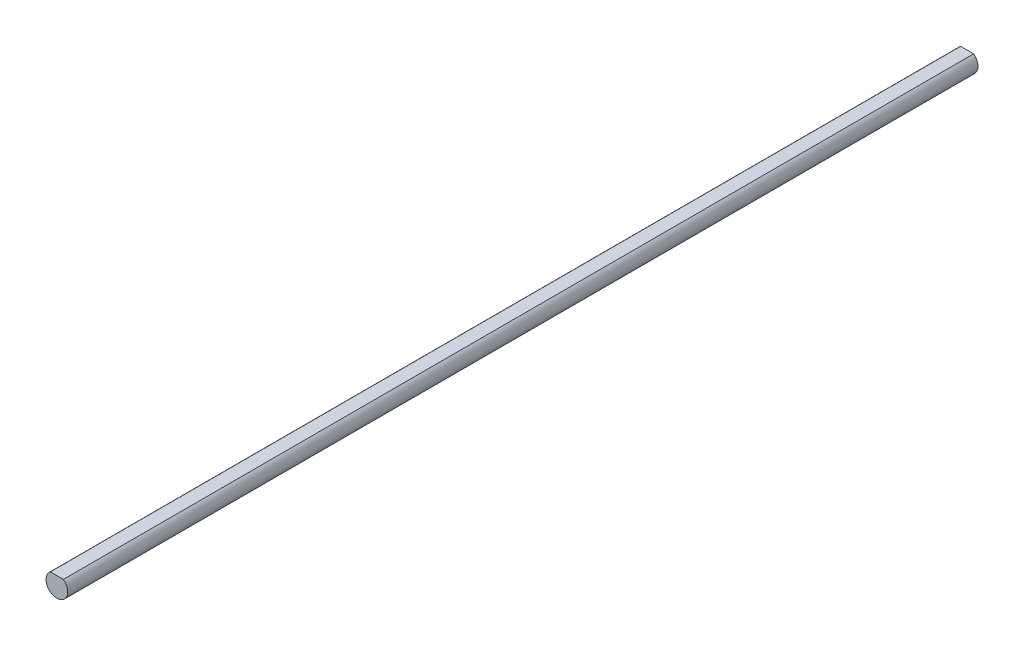
ISO-10303-21;
HEADER;
FILE_DESCRIPTION(('STEP AP214'),'2;1');
FILE_NAME('part.step','',(''),(''),'','','');
FILE_SCHEMA(('AUTOMOTIVE_DESIGN { 1 0 10303 214 1 1 1 1 }'));
ENDSEC;
DATA;
#1=APPLICATION_CONTEXT('core data for automotive mechanical design processes');
#2=APPLICATION_PROTOCOL_DEFINITION('international standard','automotive_design',2000,#1);
#3=PRODUCT_CONTEXT('',#1,'mechanical');
#4=PRODUCT('Part','Part','',(#3));
#5=PRODUCT_RELATED_PRODUCT_CATEGORY('part','',(#4));
#6=PRODUCT_DEFINITION_FORMATION('','',#4);
#7=PRODUCT_DEFINITION_CONTEXT('part definition',#1,'design');
#8=PRODUCT_DEFINITION('design','',#6,#7);
#9=PRODUCT_DEFINITION_SHAPE('','',#8);
#10=(LENGTH_UNIT() NAMED_UNIT(*) SI_UNIT(.MILLI.,.METRE.));
#11=(NAMED_UNIT(*) PLANE_ANGLE_UNIT() SI_UNIT($,.RADIAN.));
#12=(NAMED_UNIT(*) SI_UNIT($,.STERADIAN.) SOLID_ANGLE_UNIT());
#13=UNCERTAINTY_MEASURE_WITH_UNIT(LENGTH_MEASURE(1.E-05),#10,'distance_accuracy_value','');
#14=(GEOMETRIC_REPRESENTATION_CONTEXT(3) GLOBAL_UNCERTAINTY_ASSIGNED_CONTEXT((#13)) GLOBAL_UNIT_ASSIGNED_CONTEXT((#10,
#11,#12)) REPRESENTATION_CONTEXT('',''));
#15=CARTESIAN_POINT('',(0.,0.,0.));
#16=DIRECTION('',(0.,0.,1.));
#17=DIRECTION('',(1.,0.,0.));
#18=AXIS2_PLACEMENT_3D('',#15,#16,#17);
#19=CARTESIAN_POINT('',(0.,0.,265.8872));
#20=DIRECTION('',(0.,0.,-1.));
#21=DIRECTION('',(-1.,0.,0.));
#22=AXIS2_PLACEMENT_3D('',#19,#20,#21);
#23=CYLINDRICAL_SURFACE('',#22,3.175);
#24=CARTESIAN_POINT('',(0.,0.,265.8872));
#25=DIRECTION('',(0.,0.,1.));
#26=DIRECTION('',(1.,0.,0.));
#27=AXIS2_PLACEMENT_3D('',#24,#25,#26);
#28=CIRCLE('',#27,3.175);
#29=CARTESIAN_POINT('',(-1.905,2.54,265.8872));
#30=VERTEX_POINT('',#29);
#31=CARTESIAN_POINT('',(1.905,2.54,265.8872));
#32=VERTEX_POINT('',#31);
#33=EDGE_CURVE('E43',#30,#32,#28,.T.);
#34=ORIENTED_EDGE('',*,*,#33,.F.);
#35=DIRECTION('',(0.,0.,-1.));
#36=VECTOR('',#35,1.);
#37=CARTESIAN_POINT('',(-1.905,2.54,265.8872));
#38=LINE('',#37,#36);
#39=CARTESIAN_POINT('',(-1.905,2.54,0.));
#40=VERTEX_POINT('',#39);
#41=EDGE_CURVE('E60',#30,#40,#38,.T.);
#42=ORIENTED_EDGE('',*,*,#41,.T.);
#43=CARTESIAN_POINT('',(0.,0.,0.));
#44=DIRECTION('',(0.,0.,1.));
#45=DIRECTION('',(1.,0.,0.));
#46=AXIS2_PLACEMENT_3D('',#43,#44,#45);
#47=CIRCLE('',#46,3.175);
#48=CARTESIAN_POINT('',(1.905,2.54,0.));
#49=VERTEX_POINT('',#48);
#50=EDGE_CURVE('E66',#40,#49,#47,.T.);
#51=ORIENTED_EDGE('',*,*,#50,.T.);
#52=DIRECTION('',(0.,0.,-1.));
#53=VECTOR('',#52,1.);
#54=CARTESIAN_POINT('',(1.905,2.54,265.8872));
#55=LINE('',#54,#53);
#56=EDGE_CURVE('E50',#49,#32,#55,.F.);
#57=ORIENTED_EDGE('',*,*,#56,.T.);
#58=EDGE_LOOP('',(#34,#42,#51,#57));
#59=FACE_BOUND('',#58,.T.);
#60=ADVANCED_FACE('F36',(#59),#23,.T.);
#61=CARTESIAN_POINT('',(0.,0.,265.8872));
#62=DIRECTION('',(0.,0.,1.));
#63=DIRECTION('',(1.,0.,0.));
#64=AXIS2_PLACEMENT_3D('',#61,#62,#63);
#65=PLANE('',#64);
#66=DIRECTION('',(1.,0.,0.));
#67=VECTOR('',#66,1.);
#68=CARTESIAN_POINT('',(-3.40213758035115,2.54,265.8872));
#69=LINE('',#68,#67);
#70=EDGE_CURVE('E54',#30,#32,#69,.T.);
#71=ORIENTED_EDGE('',*,*,#70,.F.);
#72=ORIENTED_EDGE('',*,*,#33,.T.);
#73=EDGE_LOOP('',(#71,#72));
#74=FACE_BOUND('',#73,.T.);
#75=ADVANCED_FACE('F74',(#74),#65,.T.);
#76=CARTESIAN_POINT('',(0.,0.,0.));
#77=DIRECTION('',(0.,0.,1.));
#78=DIRECTION('',(1.,0.,0.));
#79=AXIS2_PLACEMENT_3D('',#76,#77,#78);
#80=PLANE('',#79);
#81=ORIENTED_EDGE('',*,*,#50,.F.);
#82=DIRECTION('',(1.,0.,0.));
#83=VECTOR('',#82,1.);
#84=CARTESIAN_POINT('',(0.,2.54,0.));
#85=LINE('',#84,#83);
#86=EDGE_CURVE('E11',#40,#49,#85,.T.);
#87=ORIENTED_EDGE('',*,*,#86,.T.);
#88=EDGE_LOOP('',(#81,#87));
#89=FACE_BOUND('',#88,.T.);
#90=ADVANCED_FACE('F69',(#89),#80,.F.);
#91=CARTESIAN_POINT('',(-3.40213758035115,2.54,-6.89520984968928));
#92=DIRECTION('',(0.,-1.,0.));
#93=DIRECTION('',(0.,0.,-1.));
#94=AXIS2_PLACEMENT_3D('',#91,#92,#93);
#95=PLANE('',#94);
#96=ORIENTED_EDGE('',*,*,#70,.T.);
#97=ORIENTED_EDGE('',*,*,#56,.F.);
#98=ORIENTED_EDGE('',*,*,#86,.F.);
#99=ORIENTED_EDGE('',*,*,#41,.F.);
#100=EDGE_LOOP('',(#96,#97,#98,#99));
#101=FACE_BOUND('',#100,.T.);
#102=ADVANCED_FACE('F59',(#101),#95,.F.);
#103=CLOSED_SHELL('',(#60,#75,#90,#102));
#104=MANIFOLD_SOLID_BREP('B2',#103);
#105=ADVANCED_BREP_SHAPE_REPRESENTATION('',(#18,#104),#14);
#106=SHAPE_DEFINITION_REPRESENTATION(#9,#105);
ENDSEC;
END-ISO-10303-21;
